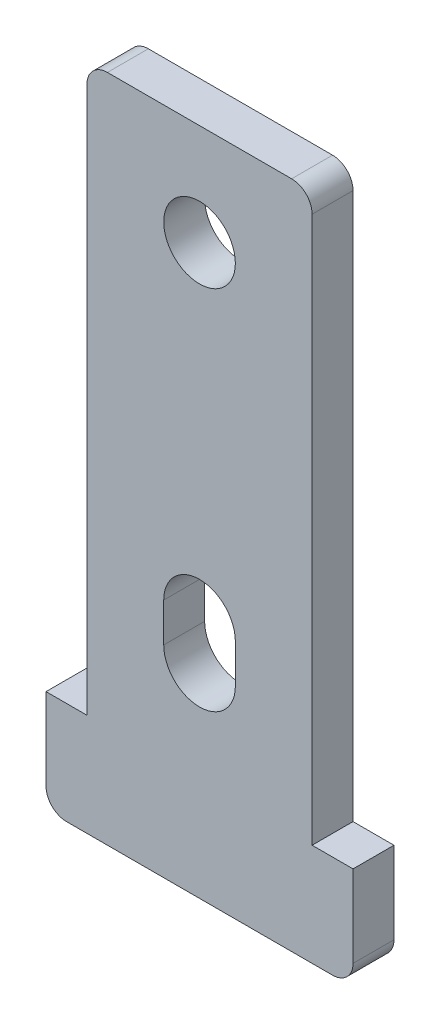
ISO-10303-21;
HEADER;
FILE_DESCRIPTION(('STEP AP214'),'2;1');
FILE_NAME('part.step','',(''),(''),'','','');
FILE_SCHEMA(('AUTOMOTIVE_DESIGN { 1 0 10303 214 1 1 1 1 }'));
ENDSEC;
DATA;
#1=APPLICATION_CONTEXT('core data for automotive mechanical design processes');
#2=APPLICATION_PROTOCOL_DEFINITION('international standard','automotive_design',2000,#1);
#3=PRODUCT_CONTEXT('',#1,'mechanical');
#4=PRODUCT('Part','Part','',(#3));
#5=PRODUCT_RELATED_PRODUCT_CATEGORY('part','',(#4));
#6=PRODUCT_DEFINITION_FORMATION('','',#4);
#7=PRODUCT_DEFINITION_CONTEXT('part definition',#1,'design');
#8=PRODUCT_DEFINITION('design','',#6,#7);
#9=PRODUCT_DEFINITION_SHAPE('','',#8);
#10=(LENGTH_UNIT() NAMED_UNIT(*) SI_UNIT(.MILLI.,.METRE.));
#11=(NAMED_UNIT(*) PLANE_ANGLE_UNIT() SI_UNIT($,.RADIAN.));
#12=(NAMED_UNIT(*) SI_UNIT($,.STERADIAN.) SOLID_ANGLE_UNIT());
#13=UNCERTAINTY_MEASURE_WITH_UNIT(LENGTH_MEASURE(1.E-05),#10,'distance_accuracy_value','');
#14=(GEOMETRIC_REPRESENTATION_CONTEXT(3) GLOBAL_UNCERTAINTY_ASSIGNED_CONTEXT((#13)) GLOBAL_UNIT_ASSIGNED_CONTEXT((#10,
#11,#12)) REPRESENTATION_CONTEXT('',''));
#15=CARTESIAN_POINT('',(0.,0.,0.));
#16=DIRECTION('',(0.,0.,1.));
#17=DIRECTION('',(1.,0.,0.));
#18=AXIS2_PLACEMENT_3D('',#15,#16,#17);
#19=CARTESIAN_POINT('',(2.79054054054054,0.,2.));
#20=DIRECTION('',(-1.,0.,0.));
#21=DIRECTION('',(0.,0.,1.));
#22=AXIS2_PLACEMENT_3D('',#19,#20,#21);
#23=PLANE('',#22);
#24=DIRECTION('',(0.,1.,0.));
#25=VECTOR('',#24,1.);
#26=CARTESIAN_POINT('',(2.79054054054054,0.,0.));
#27=LINE('',#26,#25);
#28=CARTESIAN_POINT('',(2.79054054054054,-10.8256756756757,0.));
#29=VERTEX_POINT('',#28);
#30=CARTESIAN_POINT('',(2.79054054054054,-8.92567567567568,0.));
#31=VERTEX_POINT('',#30);
#32=EDGE_CURVE('E246',#29,#31,#27,.T.);
#33=ORIENTED_EDGE('',*,*,#32,.F.);
#34=DIRECTION('',(0.,0.,-1.));
#35=VECTOR('',#34,1.);
#36=CARTESIAN_POINT('',(2.79054054054054,-10.8256756756757,2.));
#37=LINE('',#36,#35);
#38=CARTESIAN_POINT('',(2.79054054054054,-10.8256756756757,2.));
#39=VERTEX_POINT('',#38);
#40=EDGE_CURVE('E11',#39,#29,#37,.T.);
#41=ORIENTED_EDGE('',*,*,#40,.F.);
#42=DIRECTION('',(0.,1.,0.));
#43=VECTOR('',#42,1.);
#44=CARTESIAN_POINT('',(2.79054054054054,0.,2.));
#45=LINE('',#44,#43);
#46=CARTESIAN_POINT('',(2.79054054054054,-8.92567567567568,2.));
#47=VERTEX_POINT('',#46);
#48=EDGE_CURVE('E188',#39,#47,#45,.T.);
#49=ORIENTED_EDGE('',*,*,#48,.T.);
#50=DIRECTION('',(0.,0.,-1.));
#51=VECTOR('',#50,1.);
#52=CARTESIAN_POINT('',(2.79054054054054,-8.92567567567568,2.));
#53=LINE('',#52,#51);
#54=EDGE_CURVE('E65',#47,#31,#53,.T.);
#55=ORIENTED_EDGE('',*,*,#54,.T.);
#56=EDGE_LOOP('',(#33,#41,#49,#55));
#57=FACE_BOUND('',#56,.T.);
#58=ADVANCED_FACE('F45',(#57),#23,.T.);
#59=CARTESIAN_POINT('',(1.04054054054054,-10.8256756756757,2.));
#60=DIRECTION('',(0.,0.,-1.));
#61=DIRECTION('',(-1.,0.,0.));
#62=AXIS2_PLACEMENT_3D('',#59,#60,#61);
#63=CYLINDRICAL_SURFACE('',#62,1.75);
#64=CARTESIAN_POINT('',(1.04054054054054,-10.8256756756757,0.));
#65=DIRECTION('',(0.,0.,1.));
#66=DIRECTION('',(1.,0.,0.));
#67=AXIS2_PLACEMENT_3D('',#64,#65,#66);
#68=CIRCLE('',#67,1.75);
#69=CARTESIAN_POINT('',(-0.70945945945946,-10.8256756756757,0.));
#70=VERTEX_POINT('',#69);
#71=EDGE_CURVE('E173',#70,#29,#68,.T.);
#72=ORIENTED_EDGE('',*,*,#71,.F.);
#73=DIRECTION('',(0.,0.,-1.));
#74=VECTOR('',#73,1.);
#75=CARTESIAN_POINT('',(-0.70945945945946,-10.8256756756757,2.));
#76=LINE('',#75,#74);
#77=CARTESIAN_POINT('',(-0.70945945945946,-10.8256756756757,2.));
#78=VERTEX_POINT('',#77);
#79=EDGE_CURVE('E56',#78,#70,#76,.T.);
#80=ORIENTED_EDGE('',*,*,#79,.F.);
#81=CARTESIAN_POINT('',(1.04054054054054,-10.8256756756757,2.));
#82=DIRECTION('',(0.,0.,1.));
#83=DIRECTION('',(1.,0.,0.));
#84=AXIS2_PLACEMENT_3D('',#81,#82,#83);
#85=CIRCLE('',#84,1.75);
#86=EDGE_CURVE('E171',#78,#39,#85,.T.);
#87=ORIENTED_EDGE('',*,*,#86,.T.);
#88=ORIENTED_EDGE('',*,*,#40,.T.);
#89=EDGE_LOOP('',(#72,#80,#87,#88));
#90=FACE_BOUND('',#89,.T.);
#91=ADVANCED_FACE('F169',(#90),#63,.F.);
#92=CARTESIAN_POINT('',(-0.70945945945946,0.,2.));
#93=DIRECTION('',(-1.,0.,0.));
#94=DIRECTION('',(0.,0.,1.));
#95=AXIS2_PLACEMENT_3D('',#92,#93,#94);
#96=PLANE('',#95);
#97=DIRECTION('',(0.,1.,0.));
#98=VECTOR('',#97,1.);
#99=CARTESIAN_POINT('',(-0.70945945945946,0.,0.));
#100=LINE('',#99,#98);
#101=CARTESIAN_POINT('',(-0.70945945945946,-8.92567567567568,0.));
#102=VERTEX_POINT('',#101);
#103=EDGE_CURVE('E251',#70,#102,#100,.T.);
#104=ORIENTED_EDGE('',*,*,#103,.T.);
#105=DIRECTION('',(0.,0.,-1.));
#106=VECTOR('',#105,1.);
#107=CARTESIAN_POINT('',(-0.70945945945946,-8.92567567567568,2.));
#108=LINE('',#107,#106);
#109=CARTESIAN_POINT('',(-0.70945945945946,-8.92567567567568,2.));
#110=VERTEX_POINT('',#109);
#111=EDGE_CURVE('E115',#110,#102,#108,.T.);
#112=ORIENTED_EDGE('',*,*,#111,.F.);
#113=DIRECTION('',(0.,1.,0.));
#114=VECTOR('',#113,1.);
#115=CARTESIAN_POINT('',(-0.70945945945946,0.,2.));
#116=LINE('',#115,#114);
#117=EDGE_CURVE('E178',#78,#110,#116,.T.);
#118=ORIENTED_EDGE('',*,*,#117,.F.);
#119=ORIENTED_EDGE('',*,*,#79,.T.);
#120=EDGE_LOOP('',(#104,#112,#118,#119));
#121=FACE_BOUND('',#120,.T.);
#122=ADVANCED_FACE('F179',(#121),#96,.F.);
#123=CARTESIAN_POINT('',(0.,-20.6756756756757,2.));
#124=DIRECTION('',(0.,1.,0.));
#125=DIRECTION('',(-1.,0.,0.));
#126=AXIS2_PLACEMENT_3D('',#123,#124,#125);
#127=PLANE('',#126);
#128=DIRECTION('',(1.,0.,0.));
#129=VECTOR('',#128,1.);
#130=CARTESIAN_POINT('',(0.,-20.6756756756757,0.));
#131=LINE('',#130,#129);
#132=CARTESIAN_POINT('',(-5.45945945945946,-20.6756756756757,0.));
#133=VERTEX_POINT('',#132);
#134=CARTESIAN_POINT('',(7.54054054054054,-20.6756756756757,0.));
#135=VERTEX_POINT('',#134);
#136=EDGE_CURVE('E203',#133,#135,#131,.T.);
#137=ORIENTED_EDGE('',*,*,#136,.T.);
#138=DIRECTION('',(0.,0.,-1.));
#139=VECTOR('',#138,1.);
#140=CARTESIAN_POINT('',(7.54054054054054,-20.6756756756757,2.));
#141=LINE('',#140,#139);
#142=CARTESIAN_POINT('',(7.54054054054054,-20.6756756756757,2.));
#143=VERTEX_POINT('',#142);
#144=EDGE_CURVE('E49',#143,#135,#141,.T.);
#145=ORIENTED_EDGE('',*,*,#144,.F.);
#146=DIRECTION('',(1.,0.,0.));
#147=VECTOR('',#146,1.);
#148=CARTESIAN_POINT('',(0.,-20.6756756756757,2.));
#149=LINE('',#148,#147);
#150=CARTESIAN_POINT('',(-5.45945945945946,-20.6756756756757,2.));
#151=VERTEX_POINT('',#150);
#152=EDGE_CURVE('E262',#151,#143,#149,.T.);
#153=ORIENTED_EDGE('',*,*,#152,.F.);
#154=DIRECTION('',(0.,0.,-1.));
#155=VECTOR('',#154,1.);
#156=CARTESIAN_POINT('',(-5.45945945945946,-20.6756756756757,2.));
#157=LINE('',#156,#155);
#158=EDGE_CURVE('E202',#151,#133,#157,.T.);
#159=ORIENTED_EDGE('',*,*,#158,.T.);
#160=EDGE_LOOP('',(#137,#145,#153,#159));
#161=FACE_BOUND('',#160,.T.);
#162=ADVANCED_FACE('F47',(#161),#127,.F.);
#163=CARTESIAN_POINT('',(7.54054054054054,-19.6756756756757,2.));
#164=DIRECTION('',(0.,0.,-1.));
#165=DIRECTION('',(-1.,0.,0.));
#166=AXIS2_PLACEMENT_3D('',#163,#164,#165);
#167=CYLINDRICAL_SURFACE('',#166,0.999999999999999);
#168=CARTESIAN_POINT('',(7.54054054054054,-19.6756756756757,0.));
#169=DIRECTION('',(0.,0.,1.));
#170=DIRECTION('',(1.,0.,0.));
#171=AXIS2_PLACEMENT_3D('',#168,#169,#170);
#172=CIRCLE('',#171,0.999999999999999);
#173=CARTESIAN_POINT('',(8.54054054054054,-19.6756756756757,0.));
#174=VERTEX_POINT('',#173);
#175=EDGE_CURVE('E207',#135,#174,#172,.T.);
#176=ORIENTED_EDGE('',*,*,#175,.T.);
#177=DIRECTION('',(0.,0.,-1.));
#178=VECTOR('',#177,1.);
#179=CARTESIAN_POINT('',(8.54054054054054,-19.6756756756757,2.));
#180=LINE('',#179,#178);
#181=CARTESIAN_POINT('',(8.54054054054054,-19.6756756756757,2.));
#182=VERTEX_POINT('',#181);
#183=EDGE_CURVE('E299',#182,#174,#180,.T.);
#184=ORIENTED_EDGE('',*,*,#183,.F.);
#185=CARTESIAN_POINT('',(7.54054054054054,-19.6756756756757,2.));
#186=DIRECTION('',(0.,0.,1.));
#187=DIRECTION('',(1.,0.,0.));
#188=AXIS2_PLACEMENT_3D('',#185,#186,#187);
#189=CIRCLE('',#188,0.999999999999999);
#190=EDGE_CURVE('E128',#143,#182,#189,.T.);
#191=ORIENTED_EDGE('',*,*,#190,.F.);
#192=ORIENTED_EDGE('',*,*,#144,.T.);
#193=EDGE_LOOP('',(#176,#184,#191,#192));
#194=FACE_BOUND('',#193,.T.);
#195=ADVANCED_FACE('F307',(#194),#167,.T.);
#196=CARTESIAN_POINT('',(8.54054054054053,0.,2.));
#197=DIRECTION('',(-1.,0.,0.));
#198=DIRECTION('',(0.,-1.,0.));
#199=AXIS2_PLACEMENT_3D('',#196,#197,#198);
#200=PLANE('',#199);
#201=DIRECTION('',(0.,1.,0.));
#202=VECTOR('',#201,1.);
#203=CARTESIAN_POINT('',(8.54054054054053,0.,0.));
#204=LINE('',#203,#202);
#205=CARTESIAN_POINT('',(8.54054054054054,-15.6756756756757,0.));
#206=VERTEX_POINT('',#205);
#207=EDGE_CURVE('E210',#174,#206,#204,.T.);
#208=ORIENTED_EDGE('',*,*,#207,.T.);
#209=DIRECTION('',(0.,0.,-1.));
#210=VECTOR('',#209,1.);
#211=CARTESIAN_POINT('',(8.54054054054054,-15.6756756756757,2.));
#212=LINE('',#211,#210);
#213=CARTESIAN_POINT('',(8.54054054054054,-15.6756756756757,2.));
#214=VERTEX_POINT('',#213);
#215=EDGE_CURVE('E296',#214,#206,#212,.T.);
#216=ORIENTED_EDGE('',*,*,#215,.F.);
#217=DIRECTION('',(0.,1.,0.));
#218=VECTOR('',#217,1.);
#219=CARTESIAN_POINT('',(8.54054054054053,0.,2.));
#220=LINE('',#219,#218);
#221=EDGE_CURVE('E330',#182,#214,#220,.T.);
#222=ORIENTED_EDGE('',*,*,#221,.F.);
#223=ORIENTED_EDGE('',*,*,#183,.T.);
#224=EDGE_LOOP('',(#208,#216,#222,#223));
#225=FACE_BOUND('',#224,.T.);
#226=ADVANCED_FACE('F319',(#225),#200,.F.);
#227=CARTESIAN_POINT('',(0.,-15.6756756756757,2.));
#228=DIRECTION('',(0.,-1.,0.));
#229=DIRECTION('',(0.,0.,-1.));
#230=AXIS2_PLACEMENT_3D('',#227,#228,#229);
#231=PLANE('',#230);
#232=DIRECTION('',(-1.,0.,0.));
#233=VECTOR('',#232,1.);
#234=CARTESIAN_POINT('',(0.,-15.6756756756757,0.));
#235=LINE('',#234,#233);
#236=CARTESIAN_POINT('',(6.54054054054054,-15.6756756756757,0.));
#237=VERTEX_POINT('',#236);
#238=EDGE_CURVE('E213',#206,#237,#235,.T.);
#239=ORIENTED_EDGE('',*,*,#238,.T.);
#240=DIRECTION('',(0.,0.,-1.));
#241=VECTOR('',#240,1.);
#242=CARTESIAN_POINT('',(6.54054054054054,-15.6756756756757,2.));
#243=LINE('',#242,#241);
#244=CARTESIAN_POINT('',(6.54054054054054,-15.6756756756757,2.));
#245=VERTEX_POINT('',#244);
#246=EDGE_CURVE('E293',#245,#237,#243,.T.);
#247=ORIENTED_EDGE('',*,*,#246,.F.);
#248=DIRECTION('',(-1.,0.,0.));
#249=VECTOR('',#248,1.);
#250=CARTESIAN_POINT('',(0.,-15.6756756756757,2.));
#251=LINE('',#250,#249);
#252=EDGE_CURVE('E324',#214,#245,#251,.T.);
#253=ORIENTED_EDGE('',*,*,#252,.F.);
#254=ORIENTED_EDGE('',*,*,#215,.T.);
#255=EDGE_LOOP('',(#239,#247,#253,#254));
#256=FACE_BOUND('',#255,.T.);
#257=ADVANCED_FACE('F322',(#256),#231,.F.);
#258=CARTESIAN_POINT('',(6.54054054054054,0.,2.));
#259=DIRECTION('',(1.,0.,0.));
#260=DIRECTION('',(0.,1.,0.));
#261=AXIS2_PLACEMENT_3D('',#258,#259,#260);
#262=PLANE('',#261);
#263=DIRECTION('',(0.,-1.,0.));
#264=VECTOR('',#263,1.);
#265=CARTESIAN_POINT('',(6.54054054054054,0.,0.));
#266=LINE('',#265,#264);
#267=CARTESIAN_POINT('',(6.54054054054054,11.0243243243243,0.));
#268=VERTEX_POINT('',#267);
#269=EDGE_CURVE('E217',#268,#237,#266,.T.);
#270=ORIENTED_EDGE('',*,*,#269,.F.);
#271=DIRECTION('',(0.,0.,-1.));
#272=VECTOR('',#271,1.);
#273=CARTESIAN_POINT('',(6.54054054054054,11.0243243243243,2.));
#274=LINE('',#273,#272);
#275=CARTESIAN_POINT('',(6.54054054054054,11.0243243243243,2.));
#276=VERTEX_POINT('',#275);
#277=EDGE_CURVE('E290',#276,#268,#274,.T.);
#278=ORIENTED_EDGE('',*,*,#277,.F.);
#279=DIRECTION('',(0.,-1.,0.));
#280=VECTOR('',#279,1.);
#281=CARTESIAN_POINT('',(6.54054054054054,0.,2.));
#282=LINE('',#281,#280);
#283=EDGE_CURVE('E329',#276,#245,#282,.T.);
#284=ORIENTED_EDGE('',*,*,#283,.T.);
#285=ORIENTED_EDGE('',*,*,#246,.T.);
#286=EDGE_LOOP('',(#270,#278,#284,#285));
#287=FACE_BOUND('',#286,.T.);
#288=ADVANCED_FACE('F392',(#287),#262,.T.);
#289=CARTESIAN_POINT('',(5.54054054054054,11.0243243243243,2.));
#290=DIRECTION('',(0.,0.,-1.));
#291=DIRECTION('',(-1.,0.,0.));
#292=AXIS2_PLACEMENT_3D('',#289,#290,#291);
#293=CYLINDRICAL_SURFACE('',#292,1.);
#294=CARTESIAN_POINT('',(5.54054054054054,11.0243243243243,0.));
#295=DIRECTION('',(0.,0.,1.));
#296=DIRECTION('',(1.,0.,0.));
#297=AXIS2_PLACEMENT_3D('',#294,#295,#296);
#298=CIRCLE('',#297,1.);
#299=CARTESIAN_POINT('',(5.54054054054053,12.0243243243243,0.));
#300=VERTEX_POINT('',#299);
#301=EDGE_CURVE('E221',#300,#268,#298,.F.);
#302=ORIENTED_EDGE('',*,*,#301,.F.);
#303=DIRECTION('',(0.,0.,-1.));
#304=VECTOR('',#303,1.);
#305=CARTESIAN_POINT('',(5.54054054054053,12.0243243243243,2.));
#306=LINE('',#305,#304);
#307=CARTESIAN_POINT('',(5.54054054054053,12.0243243243243,2.));
#308=VERTEX_POINT('',#307);
#309=EDGE_CURVE('E287',#308,#300,#306,.T.);
#310=ORIENTED_EDGE('',*,*,#309,.F.);
#311=CARTESIAN_POINT('',(5.54054054054054,11.0243243243243,2.));
#312=DIRECTION('',(0.,0.,1.));
#313=DIRECTION('',(1.,0.,0.));
#314=AXIS2_PLACEMENT_3D('',#311,#312,#313);
#315=CIRCLE('',#314,1.);
#316=EDGE_CURVE('E334',#308,#276,#315,.F.);
#317=ORIENTED_EDGE('',*,*,#316,.T.);
#318=ORIENTED_EDGE('',*,*,#277,.T.);
#319=EDGE_LOOP('',(#302,#310,#317,#318));
#320=FACE_BOUND('',#319,.T.);
#321=ADVANCED_FACE('F389',(#320),#293,.T.);
#322=CARTESIAN_POINT('',(0.,12.0243243243243,2.));
#323=DIRECTION('',(0.,1.,0.));
#324=DIRECTION('',(0.,0.,1.));
#325=AXIS2_PLACEMENT_3D('',#322,#323,#324);
#326=PLANE('',#325);
#327=DIRECTION('',(1.,0.,0.));
#328=VECTOR('',#327,1.);
#329=CARTESIAN_POINT('',(0.,12.0243243243243,0.));
#330=LINE('',#329,#328);
#331=CARTESIAN_POINT('',(-3.45945945945945,12.0243243243243,0.));
#332=VERTEX_POINT('',#331);
#333=EDGE_CURVE('E225',#332,#300,#330,.T.);
#334=ORIENTED_EDGE('',*,*,#333,.F.);
#335=DIRECTION('',(0.,0.,-1.));
#336=VECTOR('',#335,1.);
#337=CARTESIAN_POINT('',(-3.45945945945945,12.0243243243243,2.));
#338=LINE('',#337,#336);
#339=CARTESIAN_POINT('',(-3.45945945945945,12.0243243243243,2.));
#340=VERTEX_POINT('',#339);
#341=EDGE_CURVE('E284',#340,#332,#338,.T.);
#342=ORIENTED_EDGE('',*,*,#341,.F.);
#343=DIRECTION('',(1.,0.,0.));
#344=VECTOR('',#343,1.);
#345=CARTESIAN_POINT('',(0.,12.0243243243243,2.));
#346=LINE('',#345,#344);
#347=EDGE_CURVE('E342',#340,#308,#346,.T.);
#348=ORIENTED_EDGE('',*,*,#347,.T.);
#349=ORIENTED_EDGE('',*,*,#309,.T.);
#350=EDGE_LOOP('',(#334,#342,#348,#349));
#351=FACE_BOUND('',#350,.T.);
#352=ADVANCED_FACE('F385',(#351),#326,.T.);
#353=CARTESIAN_POINT('',(-3.45945945945946,11.0243243243243,2.));
#354=DIRECTION('',(0.,0.,-1.));
#355=DIRECTION('',(-1.,0.,0.));
#356=AXIS2_PLACEMENT_3D('',#353,#354,#355);
#357=CYLINDRICAL_SURFACE('',#356,1.);
#358=CARTESIAN_POINT('',(-3.45945945945946,11.0243243243243,0.));
#359=DIRECTION('',(0.,0.,1.));
#360=DIRECTION('',(1.,0.,0.));
#361=AXIS2_PLACEMENT_3D('',#358,#359,#360);
#362=CIRCLE('',#361,1.);
#363=CARTESIAN_POINT('',(-4.45945945945946,11.0243243243243,0.));
#364=VERTEX_POINT('',#363);
#365=EDGE_CURVE('E229',#364,#332,#362,.F.);
#366=ORIENTED_EDGE('',*,*,#365,.F.);
#367=DIRECTION('',(0.,0.,-1.));
#368=VECTOR('',#367,1.);
#369=CARTESIAN_POINT('',(-4.45945945945946,11.0243243243243,2.));
#370=LINE('',#369,#368);
#371=CARTESIAN_POINT('',(-4.45945945945946,11.0243243243243,2.));
#372=VERTEX_POINT('',#371);
#373=EDGE_CURVE('E281',#372,#364,#370,.T.);
#374=ORIENTED_EDGE('',*,*,#373,.F.);
#375=CARTESIAN_POINT('',(-3.45945945945946,11.0243243243243,2.));
#376=DIRECTION('',(0.,0.,1.));
#377=DIRECTION('',(1.,0.,0.));
#378=AXIS2_PLACEMENT_3D('',#375,#376,#377);
#379=CIRCLE('',#378,1.);
#380=EDGE_CURVE('E346',#372,#340,#379,.F.);
#381=ORIENTED_EDGE('',*,*,#380,.T.);
#382=ORIENTED_EDGE('',*,*,#341,.T.);
#383=EDGE_LOOP('',(#366,#374,#381,#382));
#384=FACE_BOUND('',#383,.T.);
#385=ADVANCED_FACE('F381',(#384),#357,.T.);
#386=CARTESIAN_POINT('',(-4.45945945945946,0.,2.));
#387=DIRECTION('',(-1.,0.,0.));
#388=DIRECTION('',(0.,0.,1.));
#389=AXIS2_PLACEMENT_3D('',#386,#387,#388);
#390=PLANE('',#389);
#391=DIRECTION('',(0.,1.,0.));
#392=VECTOR('',#391,1.);
#393=CARTESIAN_POINT('',(-4.45945945945946,0.,0.));
#394=LINE('',#393,#392);
#395=CARTESIAN_POINT('',(-4.45945945945946,-15.6756756756757,0.));
#396=VERTEX_POINT('',#395);
#397=EDGE_CURVE('E233',#396,#364,#394,.T.);
#398=ORIENTED_EDGE('',*,*,#397,.F.);
#399=DIRECTION('',(0.,0.,-1.));
#400=VECTOR('',#399,1.);
#401=CARTESIAN_POINT('',(-4.45945945945946,-15.6756756756757,2.));
#402=LINE('',#401,#400);
#403=CARTESIAN_POINT('',(-4.45945945945946,-15.6756756756757,2.));
#404=VERTEX_POINT('',#403);
#405=EDGE_CURVE('E278',#404,#396,#402,.T.);
#406=ORIENTED_EDGE('',*,*,#405,.F.);
#407=DIRECTION('',(0.,1.,0.));
#408=VECTOR('',#407,1.);
#409=CARTESIAN_POINT('',(-4.45945945945946,0.,2.));
#410=LINE('',#409,#408);
#411=EDGE_CURVE('E350',#404,#372,#410,.T.);
#412=ORIENTED_EDGE('',*,*,#411,.T.);
#413=ORIENTED_EDGE('',*,*,#373,.T.);
#414=EDGE_LOOP('',(#398,#406,#412,#413));
#415=FACE_BOUND('',#414,.T.);
#416=ADVANCED_FACE('F375',(#415),#390,.T.);
#417=CARTESIAN_POINT('',(0.,-15.6756756756757,2.));
#418=DIRECTION('',(0.,-1.,0.));
#419=DIRECTION('',(0.,0.,-1.));
#420=AXIS2_PLACEMENT_3D('',#417,#418,#419);
#421=PLANE('',#420);
#422=DIRECTION('',(-1.,0.,0.));
#423=VECTOR('',#422,1.);
#424=CARTESIAN_POINT('',(0.,-15.6756756756757,0.));
#425=LINE('',#424,#423);
#426=CARTESIAN_POINT('',(-6.45945945945946,-15.6756756756757,0.));
#427=VERTEX_POINT('',#426);
#428=EDGE_CURVE('E237',#396,#427,#425,.T.);
#429=ORIENTED_EDGE('',*,*,#428,.T.);
#430=DIRECTION('',(0.,0.,-1.));
#431=VECTOR('',#430,1.);
#432=CARTESIAN_POINT('',(-6.45945945945946,-15.6756756756757,2.));
#433=LINE('',#432,#431);
#434=CARTESIAN_POINT('',(-6.45945945945946,-15.6756756756757,2.));
#435=VERTEX_POINT('',#434);
#436=EDGE_CURVE('E274',#435,#427,#433,.T.);
#437=ORIENTED_EDGE('',*,*,#436,.F.);
#438=DIRECTION('',(-1.,0.,0.));
#439=VECTOR('',#438,1.);
#440=CARTESIAN_POINT('',(0.,-15.6756756756757,2.));
#441=LINE('',#440,#439);
#442=EDGE_CURVE('E354',#404,#435,#441,.T.);
#443=ORIENTED_EDGE('',*,*,#442,.F.);
#444=ORIENTED_EDGE('',*,*,#405,.T.);
#445=EDGE_LOOP('',(#429,#437,#443,#444));
#446=FACE_BOUND('',#445,.T.);
#447=ADVANCED_FACE('F393',(#446),#421,.F.);
#448=CARTESIAN_POINT('',(-6.45945945945946,0.,2.));
#449=DIRECTION('',(1.,0.,0.));
#450=DIRECTION('',(0.,0.,-1.));
#451=AXIS2_PLACEMENT_3D('',#448,#449,#450);
#452=PLANE('',#451);
#453=DIRECTION('',(0.,-1.,0.));
#454=VECTOR('',#453,1.);
#455=CARTESIAN_POINT('',(-6.45945945945946,0.,0.));
#456=LINE('',#455,#454);
#457=CARTESIAN_POINT('',(-6.45945945945946,-19.6756756756757,0.));
#458=VERTEX_POINT('',#457);
#459=EDGE_CURVE('E240',#427,#458,#456,.T.);
#460=ORIENTED_EDGE('',*,*,#459,.T.);
#461=DIRECTION('',(0.,0.,-1.));
#462=VECTOR('',#461,1.);
#463=CARTESIAN_POINT('',(-6.45945945945946,-19.6756756756757,2.));
#464=LINE('',#463,#462);
#465=CARTESIAN_POINT('',(-6.45945945945946,-19.6756756756757,2.));
#466=VERTEX_POINT('',#465);
#467=EDGE_CURVE('E270',#466,#458,#464,.T.);
#468=ORIENTED_EDGE('',*,*,#467,.F.);
#469=DIRECTION('',(0.,-1.,0.));
#470=VECTOR('',#469,1.);
#471=CARTESIAN_POINT('',(-6.45945945945946,0.,2.));
#472=LINE('',#471,#470);
#473=EDGE_CURVE('E357',#435,#466,#472,.T.);
#474=ORIENTED_EDGE('',*,*,#473,.F.);
#475=ORIENTED_EDGE('',*,*,#436,.T.);
#476=EDGE_LOOP('',(#460,#468,#474,#475));
#477=FACE_BOUND('',#476,.T.);
#478=ADVANCED_FACE('F369',(#477),#452,.F.);
#479=CARTESIAN_POINT('',(1.04054054054054,-8.92567567567568,2.));
#480=DIRECTION('',(0.,0.,-1.));
#481=DIRECTION('',(-1.,0.,0.));
#482=AXIS2_PLACEMENT_3D('',#479,#480,#481);
#483=CYLINDRICAL_SURFACE('',#482,1.75);
#484=CARTESIAN_POINT('',(1.04054054054054,-8.92567567567568,0.));
#485=DIRECTION('',(0.,0.,1.));
#486=DIRECTION('',(1.,0.,0.));
#487=AXIS2_PLACEMENT_3D('',#484,#485,#486);
#488=CIRCLE('',#487,1.75);
#489=EDGE_CURVE('E254',#31,#102,#488,.T.);
#490=ORIENTED_EDGE('',*,*,#489,.F.);
#491=ORIENTED_EDGE('',*,*,#54,.F.);
#492=CARTESIAN_POINT('',(1.04054054054054,-8.92567567567568,2.));
#493=DIRECTION('',(0.,0.,1.));
#494=DIRECTION('',(1.,0.,0.));
#495=AXIS2_PLACEMENT_3D('',#492,#493,#494);
#496=CIRCLE('',#495,1.75);
#497=EDGE_CURVE('E183',#47,#110,#496,.T.);
#498=ORIENTED_EDGE('',*,*,#497,.T.);
#499=ORIENTED_EDGE('',*,*,#111,.T.);
#500=EDGE_LOOP('',(#490,#491,#498,#499));
#501=FACE_BOUND('',#500,.T.);
#502=ADVANCED_FACE('F400',(#501),#483,.F.);
#503=CARTESIAN_POINT('',(-5.45945945945946,-19.6756756756757,2.));
#504=DIRECTION('',(0.,0.,-1.));
#505=DIRECTION('',(-1.,0.,0.));
#506=AXIS2_PLACEMENT_3D('',#503,#504,#505);
#507=CYLINDRICAL_SURFACE('',#506,1.);
#508=CARTESIAN_POINT('',(-5.45945945945946,-19.6756756756757,0.));
#509=DIRECTION('',(0.,0.,1.));
#510=DIRECTION('',(1.,0.,0.));
#511=AXIS2_PLACEMENT_3D('',#508,#509,#510);
#512=CIRCLE('',#511,1.);
#513=EDGE_CURVE('E243',#458,#133,#512,.T.);
#514=ORIENTED_EDGE('',*,*,#513,.T.);
#515=ORIENTED_EDGE('',*,*,#158,.F.);
#516=CARTESIAN_POINT('',(-5.45945945945946,-19.6756756756757,2.));
#517=DIRECTION('',(0.,0.,1.));
#518=DIRECTION('',(1.,0.,0.));
#519=AXIS2_PLACEMENT_3D('',#516,#517,#518);
#520=CIRCLE('',#519,1.);
#521=EDGE_CURVE('E192',#466,#151,#520,.T.);
#522=ORIENTED_EDGE('',*,*,#521,.F.);
#523=ORIENTED_EDGE('',*,*,#467,.T.);
#524=EDGE_LOOP('',(#514,#515,#522,#523));
#525=FACE_BOUND('',#524,.T.);
#526=ADVANCED_FACE('F364',(#525),#507,.T.);
#527=CARTESIAN_POINT('',(1.04054054054054,7.07432432432432,2.));
#528=DIRECTION('',(0.,0.,-1.));
#529=DIRECTION('',(-1.,0.,0.));
#530=AXIS2_PLACEMENT_3D('',#527,#528,#529);
#531=CYLINDRICAL_SURFACE('',#530,1.75);
#532=CARTESIAN_POINT('',(1.04054054054054,7.07432432432432,2.));
#533=DIRECTION('',(0.,0.,1.));
#534=DIRECTION('',(1.,0.,0.));
#535=AXIS2_PLACEMENT_3D('',#532,#533,#534);
#536=CIRCLE('',#535,1.75);
#537=CARTESIAN_POINT('',(2.79054054054054,7.07432432432432,2.));
#538=VERTEX_POINT('',#537);
#539=EDGE_CURVE('E198',#538,#538,#536,.T.);
#540=ORIENTED_EDGE('',*,*,#539,.T.);
#541=EDGE_LOOP('',(#540));
#542=FACE_BOUND('',#541,.T.);
#543=CARTESIAN_POINT('',(1.04054054054054,7.07432432432432,0.));
#544=DIRECTION('',(0.,0.,1.));
#545=DIRECTION('',(1.,0.,0.));
#546=AXIS2_PLACEMENT_3D('',#543,#544,#545);
#547=CIRCLE('',#546,1.75);
#548=CARTESIAN_POINT('',(2.79054054054054,7.07432432432432,0.));
#549=VERTEX_POINT('',#548);
#550=EDGE_CURVE('E258',#549,#549,#547,.T.);
#551=ORIENTED_EDGE('',*,*,#550,.F.);
#552=EDGE_LOOP('',(#551));
#553=FACE_BOUND('',#552,.T.);
#554=ADVANCED_FACE('F412',(#542,#553),#531,.F.);
#555=CARTESIAN_POINT('',(0.,0.,2.));
#556=DIRECTION('',(0.,0.,1.));
#557=DIRECTION('',(1.,0.,0.));
#558=AXIS2_PLACEMENT_3D('',#555,#556,#557);
#559=PLANE('',#558);
#560=ORIENTED_EDGE('',*,*,#152,.T.);
#561=ORIENTED_EDGE('',*,*,#190,.T.);
#562=ORIENTED_EDGE('',*,*,#221,.T.);
#563=ORIENTED_EDGE('',*,*,#252,.T.);
#564=ORIENTED_EDGE('',*,*,#283,.F.);
#565=ORIENTED_EDGE('',*,*,#316,.F.);
#566=ORIENTED_EDGE('',*,*,#347,.F.);
#567=ORIENTED_EDGE('',*,*,#380,.F.);
#568=ORIENTED_EDGE('',*,*,#411,.F.);
#569=ORIENTED_EDGE('',*,*,#442,.T.);
#570=ORIENTED_EDGE('',*,*,#473,.T.);
#571=ORIENTED_EDGE('',*,*,#521,.T.);
#572=EDGE_LOOP('',(#560,#561,#562,#563,#564,#565,#566,#567,#568,#569,#570,#571));
#573=FACE_BOUND('',#572,.T.);
#574=ORIENTED_EDGE('',*,*,#48,.F.);
#575=ORIENTED_EDGE('',*,*,#86,.F.);
#576=ORIENTED_EDGE('',*,*,#117,.T.);
#577=ORIENTED_EDGE('',*,*,#497,.F.);
#578=EDGE_LOOP('',(#574,#575,#576,#577));
#579=FACE_BOUND('',#578,.T.);
#580=ORIENTED_EDGE('',*,*,#539,.F.);
#581=EDGE_LOOP('',(#580));
#582=FACE_BOUND('',#581,.T.);
#583=ADVANCED_FACE('F186',(#573,#579,#582),#559,.T.);
#584=CARTESIAN_POINT('',(0.,0.,0.));
#585=DIRECTION('',(0.,0.,1.));
#586=DIRECTION('',(1.,0.,0.));
#587=AXIS2_PLACEMENT_3D('',#584,#585,#586);
#588=PLANE('',#587);
#589=ORIENTED_EDGE('',*,*,#136,.F.);
#590=ORIENTED_EDGE('',*,*,#513,.F.);
#591=ORIENTED_EDGE('',*,*,#459,.F.);
#592=ORIENTED_EDGE('',*,*,#428,.F.);
#593=ORIENTED_EDGE('',*,*,#397,.T.);
#594=ORIENTED_EDGE('',*,*,#365,.T.);
#595=ORIENTED_EDGE('',*,*,#333,.T.);
#596=ORIENTED_EDGE('',*,*,#301,.T.);
#597=ORIENTED_EDGE('',*,*,#269,.T.);
#598=ORIENTED_EDGE('',*,*,#238,.F.);
#599=ORIENTED_EDGE('',*,*,#207,.F.);
#600=ORIENTED_EDGE('',*,*,#175,.F.);
#601=EDGE_LOOP('',(#589,#590,#591,#592,#593,#594,#595,#596,#597,#598,#599,#600));
#602=FACE_BOUND('',#601,.T.);
#603=ORIENTED_EDGE('',*,*,#32,.T.);
#604=ORIENTED_EDGE('',*,*,#489,.T.);
#605=ORIENTED_EDGE('',*,*,#103,.F.);
#606=ORIENTED_EDGE('',*,*,#71,.T.);
#607=EDGE_LOOP('',(#603,#604,#605,#606));
#608=FACE_BOUND('',#607,.T.);
#609=ORIENTED_EDGE('',*,*,#550,.T.);
#610=EDGE_LOOP('',(#609));
#611=FACE_BOUND('',#610,.T.);
#612=ADVANCED_FACE('F314',(#602,#608,#611),#588,.F.);
#613=CLOSED_SHELL('',(#58,#91,#122,#162,#195,#226,#257,#288,#321,#352,#385,#416,#447,#478,#502,
#526,#554,#583,#612));
#614=MANIFOLD_SOLID_BREP('B2',#613);
#615=ADVANCED_BREP_SHAPE_REPRESENTATION('',(#18,#614),#14);
#616=SHAPE_DEFINITION_REPRESENTATION(#9,#615);
ENDSEC;
END-ISO-10303-21;
